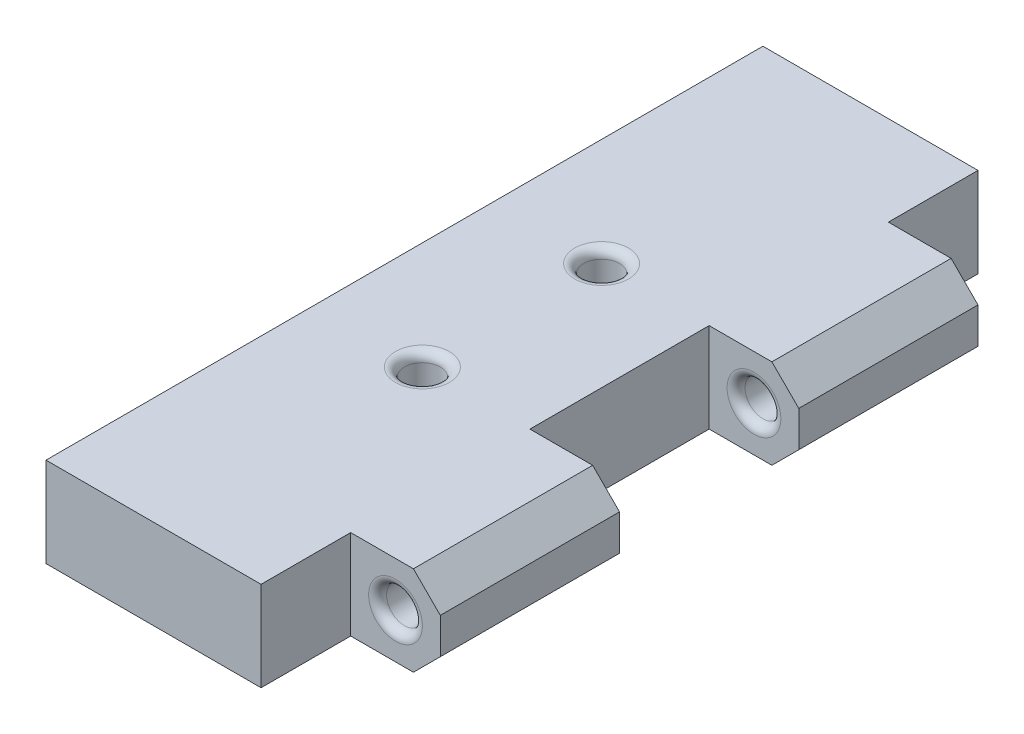
ISO-10303-21;
HEADER;
FILE_DESCRIPTION(('STEP AP214'),'2;1');
FILE_NAME('part.step','',(''),(''),'','','');
FILE_SCHEMA(('AUTOMOTIVE_DESIGN { 1 0 10303 214 1 1 1 1 }'));
ENDSEC;
DATA;
#1=APPLICATION_CONTEXT('core data for automotive mechanical design processes');
#2=APPLICATION_PROTOCOL_DEFINITION('international standard','automotive_design',2000,#1);
#3=PRODUCT_CONTEXT('',#1,'mechanical');
#4=PRODUCT('Part','Part','',(#3));
#5=PRODUCT_RELATED_PRODUCT_CATEGORY('part','',(#4));
#6=PRODUCT_DEFINITION_FORMATION('','',#4);
#7=PRODUCT_DEFINITION_CONTEXT('part definition',#1,'design');
#8=PRODUCT_DEFINITION('design','',#6,#7);
#9=PRODUCT_DEFINITION_SHAPE('','',#8);
#10=(LENGTH_UNIT() NAMED_UNIT(*) SI_UNIT(.MILLI.,.METRE.));
#11=(NAMED_UNIT(*) PLANE_ANGLE_UNIT() SI_UNIT($,.RADIAN.));
#12=(NAMED_UNIT(*) SI_UNIT($,.STERADIAN.) SOLID_ANGLE_UNIT());
#13=UNCERTAINTY_MEASURE_WITH_UNIT(LENGTH_MEASURE(1.E-05),#10,'distance_accuracy_value','');
#14=(GEOMETRIC_REPRESENTATION_CONTEXT(3) GLOBAL_UNCERTAINTY_ASSIGNED_CONTEXT((#13)) GLOBAL_UNIT_ASSIGNED_CONTEXT((#10,
#11,#12)) REPRESENTATION_CONTEXT('',''));
#15=CARTESIAN_POINT('',(0.,0.,0.));
#16=DIRECTION('',(0.,0.,1.));
#17=DIRECTION('',(1.,0.,0.));
#18=AXIS2_PLACEMENT_3D('',#15,#16,#17);
#19=CARTESIAN_POINT('',(6.,5.,20.));
#20=DIRECTION('',(-1.,0.,0.));
#21=DIRECTION('',(0.,0.,1.));
#22=AXIS2_PLACEMENT_3D('',#19,#20,#21);
#23=PLANE('',#22);
#24=DIRECTION('',(0.,-1.,0.));
#25=VECTOR('',#24,1.);
#26=CARTESIAN_POINT('',(6.,0.,-5.));
#27=LINE('',#26,#25);
#28=CARTESIAN_POINT('',(6.,5.,-5.));
#29=VERTEX_POINT('',#28);
#30=CARTESIAN_POINT('',(6.,0.,-5.));
#31=VERTEX_POINT('',#30);
#32=EDGE_CURVE('E180',#29,#31,#27,.T.);
#33=ORIENTED_EDGE('',*,*,#32,.F.);
#34=DIRECTION('',(0.,0.,-1.));
#35=VECTOR('',#34,1.);
#36=CARTESIAN_POINT('',(6.,5.,20.));
#37=LINE('',#36,#35);
#38=CARTESIAN_POINT('',(6.,5.,5.));
#39=VERTEX_POINT('',#38);
#40=EDGE_CURVE('E222',#39,#29,#37,.T.);
#41=ORIENTED_EDGE('',*,*,#40,.F.);
#42=DIRECTION('',(0.,1.,0.));
#43=VECTOR('',#42,1.);
#44=CARTESIAN_POINT('',(6.,0.,5.));
#45=LINE('',#44,#43);
#46=CARTESIAN_POINT('',(6.,0.,5.));
#47=VERTEX_POINT('',#46);
#48=EDGE_CURVE('E198',#47,#39,#45,.T.);
#49=ORIENTED_EDGE('',*,*,#48,.F.);
#50=DIRECTION('',(0.,0.,-1.));
#51=VECTOR('',#50,1.);
#52=CARTESIAN_POINT('',(6.,0.,20.));
#53=LINE('',#52,#51);
#54=EDGE_CURVE('E172',#47,#31,#53,.T.);
#55=ORIENTED_EDGE('',*,*,#54,.T.);
#56=EDGE_LOOP('',(#33,#41,#49,#55));
#57=FACE_BOUND('',#56,.T.);
#58=ADVANCED_FACE('F36',(#57),#23,.F.);
#59=DIRECTION('',(0.,1.,0.));
#60=VECTOR('',#59,1.);
#61=CARTESIAN_POINT('',(6.,0.,-15.));
#62=LINE('',#61,#60);
#63=CARTESIAN_POINT('',(6.,0.,-15.));
#64=VERTEX_POINT('',#63);
#65=CARTESIAN_POINT('',(6.,5.,-15.));
#66=VERTEX_POINT('',#65);
#67=EDGE_CURVE('E156',#64,#66,#62,.T.);
#68=ORIENTED_EDGE('',*,*,#67,.F.);
#69=CARTESIAN_POINT('',(6.,0.,-20.));
#70=VERTEX_POINT('',#69);
#71=EDGE_CURVE('E165',#64,#70,#53,.T.);
#72=ORIENTED_EDGE('',*,*,#71,.T.);
#73=DIRECTION('',(0.,-1.,0.));
#74=VECTOR('',#73,1.);
#75=CARTESIAN_POINT('',(6.,5.,-20.));
#76=LINE('',#75,#74);
#77=CARTESIAN_POINT('',(6.,5.,-20.));
#78=VERTEX_POINT('',#77);
#79=EDGE_CURVE('E232',#78,#70,#76,.T.);
#80=ORIENTED_EDGE('',*,*,#79,.F.);
#81=EDGE_CURVE('E178',#66,#78,#37,.T.);
#82=ORIENTED_EDGE('',*,*,#81,.F.);
#83=EDGE_LOOP('',(#68,#72,#80,#82));
#84=FACE_BOUND('',#83,.T.);
#85=ADVANCED_FACE('F177',(#84),#23,.F.);
#86=DIRECTION('',(0.,-1.,0.));
#87=VECTOR('',#86,1.);
#88=CARTESIAN_POINT('',(6.,0.,15.));
#89=LINE('',#88,#87);
#90=CARTESIAN_POINT('',(6.,5.,15.));
#91=VERTEX_POINT('',#90);
#92=CARTESIAN_POINT('',(6.,0.,15.));
#93=VERTEX_POINT('',#92);
#94=EDGE_CURVE('E193',#91,#93,#89,.T.);
#95=ORIENTED_EDGE('',*,*,#94,.F.);
#96=CARTESIAN_POINT('',(6.,5.,20.));
#97=VERTEX_POINT('',#96);
#98=EDGE_CURVE('E218',#97,#91,#37,.T.);
#99=ORIENTED_EDGE('',*,*,#98,.F.);
#100=DIRECTION('',(0.,-1.,0.));
#101=VECTOR('',#100,1.);
#102=CARTESIAN_POINT('',(6.,5.,20.));
#103=LINE('',#102,#101);
#104=CARTESIAN_POINT('',(6.,0.,20.));
#105=VERTEX_POINT('',#104);
#106=EDGE_CURVE('E234',#97,#105,#103,.T.);
#107=ORIENTED_EDGE('',*,*,#106,.T.);
#108=EDGE_CURVE('E175',#105,#93,#53,.T.);
#109=ORIENTED_EDGE('',*,*,#108,.T.);
#110=EDGE_LOOP('',(#95,#99,#107,#109));
#111=FACE_BOUND('',#110,.T.);
#112=ADVANCED_FACE('F339',(#111),#23,.F.);
#113=CARTESIAN_POINT('',(0.,5.,0.));
#114=DIRECTION('',(0.,1.,0.));
#115=DIRECTION('',(0.,0.,1.));
#116=AXIS2_PLACEMENT_3D('',#113,#114,#115);
#117=PLANE('',#116);
#118=CARTESIAN_POINT('',(0.,5.,5.));
#119=DIRECTION('',(0.,1.,0.));
#120=DIRECTION('',(0.,0.,1.));
#121=AXIS2_PLACEMENT_3D('',#118,#119,#120);
#122=CIRCLE('',#121,1.5);
#123=CARTESIAN_POINT('',(0.,5.,6.5));
#124=VERTEX_POINT('',#123);
#125=EDGE_CURVE('E255',#124,#124,#122,.F.);
#126=ORIENTED_EDGE('',*,*,#125,.T.);
#127=EDGE_LOOP('',(#126));
#128=FACE_BOUND('',#127,.T.);
#129=CARTESIAN_POINT('',(0.,5.,-5.));
#130=DIRECTION('',(0.,1.,0.));
#131=DIRECTION('',(0.,0.,1.));
#132=AXIS2_PLACEMENT_3D('',#129,#130,#131);
#133=CIRCLE('',#132,1.5);
#134=CARTESIAN_POINT('',(0.,5.,-3.5));
#135=VERTEX_POINT('',#134);
#136=EDGE_CURVE('E252',#135,#135,#133,.F.);
#137=ORIENTED_EDGE('',*,*,#136,.T.);
#138=EDGE_LOOP('',(#137));
#139=FACE_BOUND('',#138,.T.);
#140=DIRECTION('',(-1.,0.,0.));
#141=VECTOR('',#140,1.);
#142=CARTESIAN_POINT('',(11.,5.,-5.));
#143=LINE('',#142,#141);
#144=CARTESIAN_POINT('',(9.5,5.,-5.));
#145=VERTEX_POINT('',#144);
#146=EDGE_CURVE('E189',#145,#29,#143,.T.);
#147=ORIENTED_EDGE('',*,*,#146,.F.);
#148=DIRECTION('',(0.,0.,-1.));
#149=VECTOR('',#148,1.);
#150=CARTESIAN_POINT('',(9.5,5.,0.));
#151=LINE('',#150,#149);
#152=CARTESIAN_POINT('',(9.5,5.,-15.));
#153=VERTEX_POINT('',#152);
#154=EDGE_CURVE('E300',#145,#153,#151,.T.);
#155=ORIENTED_EDGE('',*,*,#154,.T.);
#156=DIRECTION('',(-1.,0.,0.));
#157=VECTOR('',#156,1.);
#158=CARTESIAN_POINT('',(11.,5.,-15.));
#159=LINE('',#158,#157);
#160=EDGE_CURVE('E162',#153,#66,#159,.T.);
#161=ORIENTED_EDGE('',*,*,#160,.T.);
#162=ORIENTED_EDGE('',*,*,#81,.T.);
#163=DIRECTION('',(-1.,0.,0.));
#164=VECTOR('',#163,1.);
#165=CARTESIAN_POINT('',(6.,5.,-20.));
#166=LINE('',#165,#164);
#167=CARTESIAN_POINT('',(-6.,5.,-20.));
#168=VERTEX_POINT('',#167);
#169=EDGE_CURVE('E221',#78,#168,#166,.T.);
#170=ORIENTED_EDGE('',*,*,#169,.T.);
#171=DIRECTION('',(0.,0.,1.));
#172=VECTOR('',#171,1.);
#173=CARTESIAN_POINT('',(-6.,5.,20.));
#174=LINE('',#173,#172);
#175=CARTESIAN_POINT('',(-6.,5.,20.));
#176=VERTEX_POINT('',#175);
#177=EDGE_CURVE('E213',#168,#176,#174,.T.);
#178=ORIENTED_EDGE('',*,*,#177,.T.);
#179=DIRECTION('',(1.,0.,0.));
#180=VECTOR('',#179,1.);
#181=CARTESIAN_POINT('',(6.,5.,20.));
#182=LINE('',#181,#180);
#183=EDGE_CURVE('E216',#176,#97,#182,.T.);
#184=ORIENTED_EDGE('',*,*,#183,.T.);
#185=ORIENTED_EDGE('',*,*,#98,.T.);
#186=DIRECTION('',(-1.,0.,0.));
#187=VECTOR('',#186,1.);
#188=CARTESIAN_POINT('',(11.,5.,15.));
#189=LINE('',#188,#187);
#190=CARTESIAN_POINT('',(9.5,5.,15.));
#191=VERTEX_POINT('',#190);
#192=EDGE_CURVE('E200',#191,#91,#189,.T.);
#193=ORIENTED_EDGE('',*,*,#192,.F.);
#194=DIRECTION('',(0.,0.,-1.));
#195=VECTOR('',#194,1.);
#196=CARTESIAN_POINT('',(9.5,5.,0.));
#197=LINE('',#196,#195);
#198=CARTESIAN_POINT('',(9.5,5.,5.));
#199=VERTEX_POINT('',#198);
#200=EDGE_CURVE('E298',#191,#199,#197,.T.);
#201=ORIENTED_EDGE('',*,*,#200,.T.);
#202=DIRECTION('',(-1.,0.,0.));
#203=VECTOR('',#202,1.);
#204=CARTESIAN_POINT('',(11.,5.,5.));
#205=LINE('',#204,#203);
#206=EDGE_CURVE('E206',#199,#39,#205,.T.);
#207=ORIENTED_EDGE('',*,*,#206,.T.);
#208=ORIENTED_EDGE('',*,*,#40,.T.);
#209=EDGE_LOOP('',(#147,#155,#161,#162,#170,#178,#184,#185,#193,#201,#207,#208));
#210=FACE_BOUND('',#209,.T.);
#211=ADVANCED_FACE('F326',(#128,#139,#210),#117,.T.);
#212=CARTESIAN_POINT('',(0.,0.,0.));
#213=DIRECTION('',(0.,1.,0.));
#214=DIRECTION('',(0.,0.,1.));
#215=AXIS2_PLACEMENT_3D('',#212,#213,#214);
#216=PLANE('',#215);
#217=CARTESIAN_POINT('',(0.,0.,5.));
#218=DIRECTION('',(0.,1.,0.));
#219=DIRECTION('',(0.,0.,1.));
#220=AXIS2_PLACEMENT_3D('',#217,#218,#219);
#221=CIRCLE('',#220,1.5);
#222=CARTESIAN_POINT('',(0.,0.,6.5));
#223=VERTEX_POINT('',#222);
#224=EDGE_CURVE('E243',#223,#223,#221,.T.);
#225=ORIENTED_EDGE('',*,*,#224,.T.);
#226=EDGE_LOOP('',(#225));
#227=FACE_BOUND('',#226,.T.);
#228=CARTESIAN_POINT('',(0.,0.,-5.));
#229=DIRECTION('',(0.,1.,0.));
#230=DIRECTION('',(0.,0.,1.));
#231=AXIS2_PLACEMENT_3D('',#228,#229,#230);
#232=CIRCLE('',#231,1.5);
#233=CARTESIAN_POINT('',(0.,0.,-3.5));
#234=VERTEX_POINT('',#233);
#235=EDGE_CURVE('E240',#234,#234,#232,.T.);
#236=ORIENTED_EDGE('',*,*,#235,.T.);
#237=EDGE_LOOP('',(#236));
#238=FACE_BOUND('',#237,.T.);
#239=DIRECTION('',(-1.,0.,0.));
#240=VECTOR('',#239,1.);
#241=CARTESIAN_POINT('',(11.,0.,-15.));
#242=LINE('',#241,#240);
#243=CARTESIAN_POINT('',(9.5,0.,-15.));
#244=VERTEX_POINT('',#243);
#245=EDGE_CURVE('E151',#244,#64,#242,.T.);
#246=ORIENTED_EDGE('',*,*,#245,.F.);
#247=DIRECTION('',(0.,0.,1.));
#248=VECTOR('',#247,1.);
#249=CARTESIAN_POINT('',(9.5,0.,-5.));
#250=LINE('',#249,#248);
#251=CARTESIAN_POINT('',(9.5,0.,-5.));
#252=VERTEX_POINT('',#251);
#253=EDGE_CURVE('E307',#244,#252,#250,.T.);
#254=ORIENTED_EDGE('',*,*,#253,.T.);
#255=DIRECTION('',(-1.,0.,0.));
#256=VECTOR('',#255,1.);
#257=CARTESIAN_POINT('',(11.,0.,-5.));
#258=LINE('',#257,#256);
#259=EDGE_CURVE('E161',#252,#31,#258,.T.);
#260=ORIENTED_EDGE('',*,*,#259,.T.);
#261=ORIENTED_EDGE('',*,*,#54,.F.);
#262=DIRECTION('',(-1.,0.,0.));
#263=VECTOR('',#262,1.);
#264=CARTESIAN_POINT('',(11.,0.,5.));
#265=LINE('',#264,#263);
#266=CARTESIAN_POINT('',(9.5,0.,5.));
#267=VERTEX_POINT('',#266);
#268=EDGE_CURVE('E208',#267,#47,#265,.T.);
#269=ORIENTED_EDGE('',*,*,#268,.F.);
#270=DIRECTION('',(0.,0.,1.));
#271=VECTOR('',#270,1.);
#272=CARTESIAN_POINT('',(9.5,0.,15.));
#273=LINE('',#272,#271);
#274=CARTESIAN_POINT('',(9.5,0.,15.));
#275=VERTEX_POINT('',#274);
#276=EDGE_CURVE('E305',#267,#275,#273,.T.);
#277=ORIENTED_EDGE('',*,*,#276,.T.);
#278=DIRECTION('',(-1.,0.,0.));
#279=VECTOR('',#278,1.);
#280=CARTESIAN_POINT('',(11.,0.,15.));
#281=LINE('',#280,#279);
#282=EDGE_CURVE('E210',#275,#93,#281,.T.);
#283=ORIENTED_EDGE('',*,*,#282,.T.);
#284=ORIENTED_EDGE('',*,*,#108,.F.);
#285=DIRECTION('',(1.,0.,0.));
#286=VECTOR('',#285,1.);
#287=CARTESIAN_POINT('',(6.,0.,20.));
#288=LINE('',#287,#286);
#289=CARTESIAN_POINT('',(-6.,0.,20.));
#290=VERTEX_POINT('',#289);
#291=EDGE_CURVE('E173',#290,#105,#288,.T.);
#292=ORIENTED_EDGE('',*,*,#291,.F.);
#293=DIRECTION('',(0.,0.,1.));
#294=VECTOR('',#293,1.);
#295=CARTESIAN_POINT('',(-6.,0.,20.));
#296=LINE('',#295,#294);
#297=CARTESIAN_POINT('',(-6.,0.,-20.));
#298=VERTEX_POINT('',#297);
#299=EDGE_CURVE('E212',#298,#290,#296,.T.);
#300=ORIENTED_EDGE('',*,*,#299,.F.);
#301=DIRECTION('',(-1.,0.,0.));
#302=VECTOR('',#301,1.);
#303=CARTESIAN_POINT('',(6.,0.,-20.));
#304=LINE('',#303,#302);
#305=EDGE_CURVE('E168',#70,#298,#304,.T.);
#306=ORIENTED_EDGE('',*,*,#305,.F.);
#307=ORIENTED_EDGE('',*,*,#71,.F.);
#308=EDGE_LOOP('',(#246,#254,#260,#261,#269,#277,#283,#284,#292,#300,#306,#307));
#309=FACE_BOUND('',#308,.T.);
#310=ADVANCED_FACE('F166',(#227,#238,#309),#216,.F.);
#311=CARTESIAN_POINT('',(-6.,5.,20.));
#312=DIRECTION('',(1.,0.,0.));
#313=DIRECTION('',(0.,0.,-1.));
#314=AXIS2_PLACEMENT_3D('',#311,#312,#313);
#315=PLANE('',#314);
#316=ORIENTED_EDGE('',*,*,#299,.T.);
#317=DIRECTION('',(0.,-1.,0.));
#318=VECTOR('',#317,1.);
#319=CARTESIAN_POINT('',(-6.,5.,20.));
#320=LINE('',#319,#318);
#321=EDGE_CURVE('E237',#176,#290,#320,.T.);
#322=ORIENTED_EDGE('',*,*,#321,.F.);
#323=ORIENTED_EDGE('',*,*,#177,.F.);
#324=DIRECTION('',(0.,-1.,0.));
#325=VECTOR('',#324,1.);
#326=CARTESIAN_POINT('',(-6.,5.,-20.));
#327=LINE('',#326,#325);
#328=EDGE_CURVE('E224',#168,#298,#327,.T.);
#329=ORIENTED_EDGE('',*,*,#328,.T.);
#330=EDGE_LOOP('',(#316,#322,#323,#329));
#331=FACE_BOUND('',#330,.T.);
#332=ADVANCED_FACE('F345',(#331),#315,.F.);
#333=CARTESIAN_POINT('',(6.,5.,20.));
#334=DIRECTION('',(0.,0.,-1.));
#335=DIRECTION('',(-1.,0.,0.));
#336=AXIS2_PLACEMENT_3D('',#333,#334,#335);
#337=PLANE('',#336);
#338=ORIENTED_EDGE('',*,*,#291,.T.);
#339=ORIENTED_EDGE('',*,*,#106,.F.);
#340=ORIENTED_EDGE('',*,*,#183,.F.);
#341=ORIENTED_EDGE('',*,*,#321,.T.);
#342=EDGE_LOOP('',(#338,#339,#340,#341));
#343=FACE_BOUND('',#342,.T.);
#344=ADVANCED_FACE('F342',(#343),#337,.F.);
#345=CARTESIAN_POINT('',(6.,5.,-20.));
#346=DIRECTION('',(0.,0.,1.));
#347=DIRECTION('',(1.,0.,0.));
#348=AXIS2_PLACEMENT_3D('',#345,#346,#347);
#349=PLANE('',#348);
#350=ORIENTED_EDGE('',*,*,#305,.T.);
#351=ORIENTED_EDGE('',*,*,#328,.F.);
#352=ORIENTED_EDGE('',*,*,#169,.F.);
#353=ORIENTED_EDGE('',*,*,#79,.T.);
#354=EDGE_LOOP('',(#350,#351,#352,#353));
#355=FACE_BOUND('',#354,.T.);
#356=ADVANCED_FACE('F350',(#355),#349,.F.);
#357=CARTESIAN_POINT('',(0.,5.,-5.));
#358=DIRECTION('',(0.,-1.,0.));
#359=DIRECTION('',(0.,0.,-1.));
#360=AXIS2_PLACEMENT_3D('',#357,#358,#359);
#361=CYLINDRICAL_SURFACE('',#360,1.);
#362=CARTESIAN_POINT('',(0.,0.5,-5.));
#363=DIRECTION('',(0.,1.,0.));
#364=DIRECTION('',(0.,0.,1.));
#365=AXIS2_PLACEMENT_3D('',#362,#363,#364);
#366=CIRCLE('',#365,1.);
#367=CARTESIAN_POINT('',(0.,0.5,-4.));
#368=VERTEX_POINT('',#367);
#369=EDGE_CURVE('E261',#368,#368,#366,.F.);
#370=ORIENTED_EDGE('',*,*,#369,.T.);
#371=EDGE_LOOP('',(#370));
#372=FACE_BOUND('',#371,.T.);
#373=CARTESIAN_POINT('',(0.,4.5,-5.));
#374=DIRECTION('',(0.,1.,0.));
#375=DIRECTION('',(0.,0.,1.));
#376=AXIS2_PLACEMENT_3D('',#373,#374,#375);
#377=CIRCLE('',#376,1.);
#378=CARTESIAN_POINT('',(0.,4.5,-4.));
#379=VERTEX_POINT('',#378);
#380=EDGE_CURVE('E258',#379,#379,#377,.T.);
#381=ORIENTED_EDGE('',*,*,#380,.T.);
#382=EDGE_LOOP('',(#381));
#383=FACE_BOUND('',#382,.T.);
#384=ADVANCED_FACE('F399',(#372,#383),#361,.F.);
#385=CARTESIAN_POINT('',(0.,5.,5.));
#386=DIRECTION('',(0.,-1.,0.));
#387=DIRECTION('',(0.,0.,-1.));
#388=AXIS2_PLACEMENT_3D('',#385,#386,#387);
#389=CYLINDRICAL_SURFACE('',#388,1.);
#390=CARTESIAN_POINT('',(0.,0.5,5.));
#391=DIRECTION('',(0.,1.,0.));
#392=DIRECTION('',(0.,0.,1.));
#393=AXIS2_PLACEMENT_3D('',#390,#391,#392);
#394=CIRCLE('',#393,1.);
#395=CARTESIAN_POINT('',(0.,0.5,6.));
#396=VERTEX_POINT('',#395);
#397=EDGE_CURVE('E249',#396,#396,#394,.F.);
#398=ORIENTED_EDGE('',*,*,#397,.T.);
#399=EDGE_LOOP('',(#398));
#400=FACE_BOUND('',#399,.T.);
#401=CARTESIAN_POINT('',(0.,4.5,5.));
#402=DIRECTION('',(0.,1.,0.));
#403=DIRECTION('',(0.,0.,1.));
#404=AXIS2_PLACEMENT_3D('',#401,#402,#403);
#405=CIRCLE('',#404,1.);
#406=CARTESIAN_POINT('',(0.,4.5,6.));
#407=VERTEX_POINT('',#406);
#408=EDGE_CURVE('E246',#407,#407,#405,.T.);
#409=ORIENTED_EDGE('',*,*,#408,.T.);
#410=EDGE_LOOP('',(#409));
#411=FACE_BOUND('',#410,.T.);
#412=ADVANCED_FACE('F406',(#400,#411),#389,.F.);
#413=CARTESIAN_POINT('',(11.,0.,15.));
#414=DIRECTION('',(0.,0.,-1.));
#415=DIRECTION('',(-1.,0.,0.));
#416=AXIS2_PLACEMENT_3D('',#413,#414,#415);
#417=PLANE('',#416);
#418=CARTESIAN_POINT('',(8.5,2.5,15.));
#419=DIRECTION('',(0.,0.,-1.));
#420=DIRECTION('',(-1.,0.,0.));
#421=AXIS2_PLACEMENT_3D('',#418,#419,#420);
#422=CIRCLE('',#421,1.5);
#423=CARTESIAN_POINT('',(7.,2.5,15.));
#424=VERTEX_POINT('',#423);
#425=EDGE_CURVE('E273',#424,#424,#422,.T.);
#426=ORIENTED_EDGE('',*,*,#425,.T.);
#427=EDGE_LOOP('',(#426));
#428=FACE_BOUND('',#427,.T.);
#429=ORIENTED_EDGE('',*,*,#282,.F.);
#430=DIRECTION('',(0.707106781186548,0.707106781186547,0.));
#431=VECTOR('',#430,1.);
#432=CARTESIAN_POINT('',(11.,1.5,15.));
#433=LINE('',#432,#431);
#434=CARTESIAN_POINT('',(11.,1.5,15.));
#435=VERTEX_POINT('',#434);
#436=EDGE_CURVE('E11',#275,#435,#433,.T.);
#437=ORIENTED_EDGE('',*,*,#436,.T.);
#438=DIRECTION('',(0.,-1.,0.));
#439=VECTOR('',#438,1.);
#440=CARTESIAN_POINT('',(11.,0.,15.));
#441=LINE('',#440,#439);
#442=CARTESIAN_POINT('',(11.,3.5,15.));
#443=VERTEX_POINT('',#442);
#444=EDGE_CURVE('E194',#443,#435,#441,.T.);
#445=ORIENTED_EDGE('',*,*,#444,.F.);
#446=DIRECTION('',(0.707106781186548,-0.707106781186547,0.));
#447=VECTOR('',#446,1.);
#448=CARTESIAN_POINT('',(11.,3.5,15.));
#449=LINE('',#448,#447);
#450=EDGE_CURVE('E44',#443,#191,#449,.F.);
#451=ORIENTED_EDGE('',*,*,#450,.T.);
#452=ORIENTED_EDGE('',*,*,#192,.T.);
#453=ORIENTED_EDGE('',*,*,#94,.T.);
#454=EDGE_LOOP('',(#429,#437,#445,#451,#452,#453));
#455=FACE_BOUND('',#454,.T.);
#456=ADVANCED_FACE('F319',(#428,#455),#417,.F.);
#457=CARTESIAN_POINT('',(11.,0.,5.));
#458=DIRECTION('',(0.,0.,1.));
#459=DIRECTION('',(1.,0.,0.));
#460=AXIS2_PLACEMENT_3D('',#457,#458,#459);
#461=PLANE('',#460);
#462=CARTESIAN_POINT('',(8.5,2.5,5.));
#463=DIRECTION('',(0.,0.,1.));
#464=DIRECTION('',(1.,0.,0.));
#465=AXIS2_PLACEMENT_3D('',#462,#463,#464);
#466=CIRCLE('',#465,1.5);
#467=CARTESIAN_POINT('',(10.,2.5,5.));
#468=VERTEX_POINT('',#467);
#469=EDGE_CURVE('E264',#468,#468,#466,.T.);
#470=ORIENTED_EDGE('',*,*,#469,.T.);
#471=EDGE_LOOP('',(#470));
#472=FACE_BOUND('',#471,.T.);
#473=DIRECTION('',(0.,1.,0.));
#474=VECTOR('',#473,1.);
#475=CARTESIAN_POINT('',(11.,0.,5.));
#476=LINE('',#475,#474);
#477=CARTESIAN_POINT('',(11.,1.5,5.));
#478=VERTEX_POINT('',#477);
#479=CARTESIAN_POINT('',(11.,3.5,5.));
#480=VERTEX_POINT('',#479);
#481=EDGE_CURVE('E197',#478,#480,#476,.T.);
#482=ORIENTED_EDGE('',*,*,#481,.F.);
#483=DIRECTION('',(-0.707106781186548,-0.707106781186547,0.));
#484=VECTOR('',#483,1.);
#485=CARTESIAN_POINT('',(11.,1.5,5.));
#486=LINE('',#485,#484);
#487=EDGE_CURVE('E59',#478,#267,#486,.T.);
#488=ORIENTED_EDGE('',*,*,#487,.T.);
#489=ORIENTED_EDGE('',*,*,#268,.T.);
#490=ORIENTED_EDGE('',*,*,#48,.T.);
#491=ORIENTED_EDGE('',*,*,#206,.F.);
#492=DIRECTION('',(-0.707106781186548,0.707106781186547,0.));
#493=VECTOR('',#492,1.);
#494=CARTESIAN_POINT('',(11.,3.5,5.));
#495=LINE('',#494,#493);
#496=EDGE_CURVE('E51',#199,#480,#495,.F.);
#497=ORIENTED_EDGE('',*,*,#496,.T.);
#498=EDGE_LOOP('',(#482,#488,#489,#490,#491,#497));
#499=FACE_BOUND('',#498,.T.);
#500=ADVANCED_FACE('F330',(#472,#499),#461,.F.);
#501=CARTESIAN_POINT('',(11.,0.,0.));
#502=DIRECTION('',(1.,0.,0.));
#503=DIRECTION('',(0.,0.,-1.));
#504=AXIS2_PLACEMENT_3D('',#501,#502,#503);
#505=PLANE('',#504);
#506=ORIENTED_EDGE('',*,*,#444,.T.);
#507=DIRECTION('',(0.,0.,-1.));
#508=VECTOR('',#507,1.);
#509=CARTESIAN_POINT('',(11.,1.5,5.));
#510=LINE('',#509,#508);
#511=EDGE_CURVE('E312',#435,#478,#510,.T.);
#512=ORIENTED_EDGE('',*,*,#511,.T.);
#513=ORIENTED_EDGE('',*,*,#481,.T.);
#514=DIRECTION('',(0.,0.,1.));
#515=VECTOR('',#514,1.);
#516=CARTESIAN_POINT('',(11.,3.5,0.));
#517=LINE('',#516,#515);
#518=EDGE_CURVE('E309',#480,#443,#517,.T.);
#519=ORIENTED_EDGE('',*,*,#518,.T.);
#520=EDGE_LOOP('',(#506,#512,#513,#519));
#521=FACE_BOUND('',#520,.T.);
#522=ADVANCED_FACE('F329',(#521),#505,.T.);
#523=CARTESIAN_POINT('',(11.,0.,-5.));
#524=DIRECTION('',(0.,0.,-1.));
#525=DIRECTION('',(-1.,0.,0.));
#526=AXIS2_PLACEMENT_3D('',#523,#524,#525);
#527=PLANE('',#526);
#528=CARTESIAN_POINT('',(8.5,2.5,-5.));
#529=DIRECTION('',(0.,0.,-1.));
#530=DIRECTION('',(-1.,0.,0.));
#531=AXIS2_PLACEMENT_3D('',#528,#529,#530);
#532=CIRCLE('',#531,1.5);
#533=CARTESIAN_POINT('',(7.,2.5,-5.));
#534=VERTEX_POINT('',#533);
#535=EDGE_CURVE('E285',#534,#534,#532,.T.);
#536=ORIENTED_EDGE('',*,*,#535,.T.);
#537=EDGE_LOOP('',(#536));
#538=FACE_BOUND('',#537,.T.);
#539=DIRECTION('',(0.,-1.,0.));
#540=VECTOR('',#539,1.);
#541=CARTESIAN_POINT('',(11.,0.,-5.));
#542=LINE('',#541,#540);
#543=CARTESIAN_POINT('',(11.,3.5,-5.));
#544=VERTEX_POINT('',#543);
#545=CARTESIAN_POINT('',(11.,1.5,-5.));
#546=VERTEX_POINT('',#545);
#547=EDGE_CURVE('E179',#544,#546,#542,.T.);
#548=ORIENTED_EDGE('',*,*,#547,.F.);
#549=DIRECTION('',(0.707106781186548,-0.707106781186547,0.));
#550=VECTOR('',#549,1.);
#551=CARTESIAN_POINT('',(11.,3.5,-5.));
#552=LINE('',#551,#550);
#553=EDGE_CURVE('E296',#544,#145,#552,.F.);
#554=ORIENTED_EDGE('',*,*,#553,.T.);
#555=ORIENTED_EDGE('',*,*,#146,.T.);
#556=ORIENTED_EDGE('',*,*,#32,.T.);
#557=ORIENTED_EDGE('',*,*,#259,.F.);
#558=DIRECTION('',(0.707106781186548,0.707106781186547,0.));
#559=VECTOR('',#558,1.);
#560=CARTESIAN_POINT('',(11.,1.5,-5.));
#561=LINE('',#560,#559);
#562=EDGE_CURVE('E294',#252,#546,#561,.T.);
#563=ORIENTED_EDGE('',*,*,#562,.T.);
#564=EDGE_LOOP('',(#548,#554,#555,#556,#557,#563));
#565=FACE_BOUND('',#564,.T.);
#566=ADVANCED_FACE('F359',(#538,#565),#527,.F.);
#567=CARTESIAN_POINT('',(11.,0.,-15.));
#568=DIRECTION('',(0.,0.,1.));
#569=DIRECTION('',(1.,0.,0.));
#570=AXIS2_PLACEMENT_3D('',#567,#568,#569);
#571=PLANE('',#570);
#572=CARTESIAN_POINT('',(8.5,2.5,-15.));
#573=DIRECTION('',(0.,0.,1.));
#574=DIRECTION('',(1.,0.,0.));
#575=AXIS2_PLACEMENT_3D('',#572,#573,#574);
#576=CIRCLE('',#575,1.5);
#577=CARTESIAN_POINT('',(10.,2.5,-15.));
#578=VERTEX_POINT('',#577);
#579=EDGE_CURVE('E276',#578,#578,#576,.T.);
#580=ORIENTED_EDGE('',*,*,#579,.T.);
#581=EDGE_LOOP('',(#580));
#582=FACE_BOUND('',#581,.T.);
#583=ORIENTED_EDGE('',*,*,#160,.F.);
#584=DIRECTION('',(-0.707106781186548,0.707106781186547,0.));
#585=VECTOR('',#584,1.);
#586=CARTESIAN_POINT('',(11.,3.5,-15.));
#587=LINE('',#586,#585);
#588=CARTESIAN_POINT('',(11.,3.5,-15.));
#589=VERTEX_POINT('',#588);
#590=EDGE_CURVE('E303',#153,#589,#587,.F.);
#591=ORIENTED_EDGE('',*,*,#590,.T.);
#592=DIRECTION('',(0.,1.,0.));
#593=VECTOR('',#592,1.);
#594=CARTESIAN_POINT('',(11.,0.,-15.));
#595=LINE('',#594,#593);
#596=CARTESIAN_POINT('',(11.,1.5,-15.));
#597=VERTEX_POINT('',#596);
#598=EDGE_CURVE('E183',#597,#589,#595,.T.);
#599=ORIENTED_EDGE('',*,*,#598,.F.);
#600=DIRECTION('',(-0.707106781186548,-0.707106781186547,0.));
#601=VECTOR('',#600,1.);
#602=CARTESIAN_POINT('',(11.,1.5,-15.));
#603=LINE('',#602,#601);
#604=EDGE_CURVE('E158',#597,#244,#603,.T.);
#605=ORIENTED_EDGE('',*,*,#604,.T.);
#606=ORIENTED_EDGE('',*,*,#245,.T.);
#607=ORIENTED_EDGE('',*,*,#67,.T.);
#608=EDGE_LOOP('',(#583,#591,#599,#605,#606,#607));
#609=FACE_BOUND('',#608,.T.);
#610=ADVANCED_FACE('F154',(#582,#609),#571,.F.);
#611=CARTESIAN_POINT('',(11.,0.,0.));
#612=DIRECTION('',(1.,0.,0.));
#613=DIRECTION('',(0.,0.,-1.));
#614=AXIS2_PLACEMENT_3D('',#611,#612,#613);
#615=PLANE('',#614);
#616=ORIENTED_EDGE('',*,*,#598,.T.);
#617=DIRECTION('',(0.,0.,1.));
#618=VECTOR('',#617,1.);
#619=CARTESIAN_POINT('',(11.,3.5,0.));
#620=LINE('',#619,#618);
#621=EDGE_CURVE('E291',#589,#544,#620,.T.);
#622=ORIENTED_EDGE('',*,*,#621,.T.);
#623=ORIENTED_EDGE('',*,*,#547,.T.);
#624=DIRECTION('',(0.,0.,-1.));
#625=VECTOR('',#624,1.);
#626=CARTESIAN_POINT('',(11.,1.5,-15.));
#627=LINE('',#626,#625);
#628=EDGE_CURVE('E288',#546,#597,#627,.T.);
#629=ORIENTED_EDGE('',*,*,#628,.T.);
#630=EDGE_LOOP('',(#616,#622,#623,#629));
#631=FACE_BOUND('',#630,.T.);
#632=ADVANCED_FACE('F367',(#631),#615,.T.);
#633=CARTESIAN_POINT('',(8.5,2.5,20.));
#634=DIRECTION('',(0.,0.,-1.));
#635=DIRECTION('',(-1.,0.,0.));
#636=AXIS2_PLACEMENT_3D('',#633,#634,#635);
#637=CYLINDRICAL_SURFACE('',#636,1.);
#638=CARTESIAN_POINT('',(8.5,2.5,-14.5));
#639=DIRECTION('',(0.,0.,1.));
#640=DIRECTION('',(1.,0.,0.));
#641=AXIS2_PLACEMENT_3D('',#638,#639,#640);
#642=CIRCLE('',#641,1.);
#643=CARTESIAN_POINT('',(9.5,2.5,-14.5));
#644=VERTEX_POINT('',#643);
#645=EDGE_CURVE('E282',#644,#644,#642,.F.);
#646=ORIENTED_EDGE('',*,*,#645,.T.);
#647=EDGE_LOOP('',(#646));
#648=FACE_BOUND('',#647,.T.);
#649=CARTESIAN_POINT('',(8.5,2.5,-5.50000000000001));
#650=DIRECTION('',(0.,0.,-1.));
#651=DIRECTION('',(-1.,0.,0.));
#652=AXIS2_PLACEMENT_3D('',#649,#650,#651);
#653=CIRCLE('',#652,1.);
#654=CARTESIAN_POINT('',(7.5,2.5,-5.50000000000001));
#655=VERTEX_POINT('',#654);
#656=EDGE_CURVE('E279',#655,#655,#653,.F.);
#657=ORIENTED_EDGE('',*,*,#656,.T.);
#658=EDGE_LOOP('',(#657));
#659=FACE_BOUND('',#658,.T.);
#660=ADVANCED_FACE('F514',(#648,#659),#637,.F.);
#661=CARTESIAN_POINT('',(8.5,2.5,5.5));
#662=DIRECTION('',(0.,0.,1.));
#663=DIRECTION('',(1.,0.,0.));
#664=AXIS2_PLACEMENT_3D('',#661,#662,#663);
#665=CIRCLE('',#664,1.);
#666=CARTESIAN_POINT('',(9.5,2.5,5.5));
#667=VERTEX_POINT('',#666);
#668=EDGE_CURVE('E270',#667,#667,#665,.F.);
#669=ORIENTED_EDGE('',*,*,#668,.T.);
#670=EDGE_LOOP('',(#669));
#671=FACE_BOUND('',#670,.T.);
#672=CARTESIAN_POINT('',(8.5,2.5,14.5));
#673=DIRECTION('',(0.,0.,-1.));
#674=DIRECTION('',(-1.,0.,0.));
#675=AXIS2_PLACEMENT_3D('',#672,#673,#674);
#676=CIRCLE('',#675,1.);
#677=CARTESIAN_POINT('',(7.5,2.5,14.5));
#678=VERTEX_POINT('',#677);
#679=EDGE_CURVE('E267',#678,#678,#676,.F.);
#680=ORIENTED_EDGE('',*,*,#679,.T.);
#681=EDGE_LOOP('',(#680));
#682=FACE_BOUND('',#681,.T.);
#683=ADVANCED_FACE('F417',(#671,#682),#637,.F.);
#684=CARTESIAN_POINT('',(0.,0.5,5.));
#685=DIRECTION('',(0.,1.,0.));
#686=DIRECTION('',(0.,0.,1.));
#687=AXIS2_PLACEMENT_3D('',#684,#685,#686);
#688=TOROIDAL_SURFACE('',#687,1.5,0.5);
#689=ORIENTED_EDGE('',*,*,#397,.F.);
#690=EDGE_LOOP('',(#689));
#691=FACE_BOUND('',#690,.T.);
#692=ORIENTED_EDGE('',*,*,#224,.F.);
#693=EDGE_LOOP('',(#692));
#694=FACE_BOUND('',#693,.T.);
#695=ADVANCED_FACE('F413',(#691,#694),#688,.T.);
#696=CARTESIAN_POINT('',(0.,4.5,5.));
#697=DIRECTION('',(0.,1.,0.));
#698=DIRECTION('',(0.,0.,1.));
#699=AXIS2_PLACEMENT_3D('',#696,#697,#698);
#700=TOROIDAL_SURFACE('',#699,1.5,0.5);
#701=ORIENTED_EDGE('',*,*,#125,.F.);
#702=EDGE_LOOP('',(#701));
#703=FACE_BOUND('',#702,.T.);
#704=ORIENTED_EDGE('',*,*,#408,.F.);
#705=EDGE_LOOP('',(#704));
#706=FACE_BOUND('',#705,.T.);
#707=ADVANCED_FACE('F416',(#703,#706),#700,.T.);
#708=CARTESIAN_POINT('',(0.,0.5,-5.));
#709=DIRECTION('',(0.,1.,0.));
#710=DIRECTION('',(0.,0.,1.));
#711=AXIS2_PLACEMENT_3D('',#708,#709,#710);
#712=TOROIDAL_SURFACE('',#711,1.5,0.5);
#713=ORIENTED_EDGE('',*,*,#369,.F.);
#714=EDGE_LOOP('',(#713));
#715=FACE_BOUND('',#714,.T.);
#716=ORIENTED_EDGE('',*,*,#235,.F.);
#717=EDGE_LOOP('',(#716));
#718=FACE_BOUND('',#717,.T.);
#719=ADVANCED_FACE('F421',(#715,#718),#712,.T.);
#720=CARTESIAN_POINT('',(0.,4.5,-5.));
#721=DIRECTION('',(0.,1.,0.));
#722=DIRECTION('',(0.,0.,1.));
#723=AXIS2_PLACEMENT_3D('',#720,#721,#722);
#724=TOROIDAL_SURFACE('',#723,1.5,0.5);
#725=ORIENTED_EDGE('',*,*,#136,.F.);
#726=EDGE_LOOP('',(#725));
#727=FACE_BOUND('',#726,.T.);
#728=ORIENTED_EDGE('',*,*,#380,.F.);
#729=EDGE_LOOP('',(#728));
#730=FACE_BOUND('',#729,.T.);
#731=ADVANCED_FACE('F425',(#727,#730),#724,.T.);
#732=CARTESIAN_POINT('',(8.5,2.5,5.5));
#733=DIRECTION('',(0.,0.,1.));
#734=DIRECTION('',(1.,0.,0.));
#735=AXIS2_PLACEMENT_3D('',#732,#733,#734);
#736=TOROIDAL_SURFACE('',#735,1.5,0.5);
#737=ORIENTED_EDGE('',*,*,#668,.F.);
#738=EDGE_LOOP('',(#737));
#739=FACE_BOUND('',#738,.T.);
#740=ORIENTED_EDGE('',*,*,#469,.F.);
#741=EDGE_LOOP('',(#740));
#742=FACE_BOUND('',#741,.T.);
#743=ADVANCED_FACE('F429',(#739,#742),#736,.T.);
#744=CARTESIAN_POINT('',(8.5,2.5,14.5));
#745=DIRECTION('',(0.,0.,-1.));
#746=DIRECTION('',(-1.,0.,0.));
#747=AXIS2_PLACEMENT_3D('',#744,#745,#746);
#748=TOROIDAL_SURFACE('',#747,1.5,0.5);
#749=ORIENTED_EDGE('',*,*,#679,.F.);
#750=EDGE_LOOP('',(#749));
#751=FACE_BOUND('',#750,.T.);
#752=ORIENTED_EDGE('',*,*,#425,.F.);
#753=EDGE_LOOP('',(#752));
#754=FACE_BOUND('',#753,.T.);
#755=ADVANCED_FACE('F433',(#751,#754),#748,.T.);
#756=CARTESIAN_POINT('',(8.5,2.5,-14.5));
#757=DIRECTION('',(0.,0.,1.));
#758=DIRECTION('',(1.,0.,0.));
#759=AXIS2_PLACEMENT_3D('',#756,#757,#758);
#760=TOROIDAL_SURFACE('',#759,1.5,0.5);
#761=ORIENTED_EDGE('',*,*,#645,.F.);
#762=EDGE_LOOP('',(#761));
#763=FACE_BOUND('',#762,.T.);
#764=ORIENTED_EDGE('',*,*,#579,.F.);
#765=EDGE_LOOP('',(#764));
#766=FACE_BOUND('',#765,.T.);
#767=ADVANCED_FACE('F437',(#763,#766),#760,.T.);
#768=CARTESIAN_POINT('',(8.5,2.5,-5.50000000000001));
#769=DIRECTION('',(0.,0.,-1.));
#770=DIRECTION('',(-1.,0.,0.));
#771=AXIS2_PLACEMENT_3D('',#768,#769,#770);
#772=TOROIDAL_SURFACE('',#771,1.5,0.5);
#773=ORIENTED_EDGE('',*,*,#656,.F.);
#774=EDGE_LOOP('',(#773));
#775=FACE_BOUND('',#774,.T.);
#776=ORIENTED_EDGE('',*,*,#535,.F.);
#777=EDGE_LOOP('',(#776));
#778=FACE_BOUND('',#777,.T.);
#779=ADVANCED_FACE('F377',(#775,#778),#772,.T.);
#780=CARTESIAN_POINT('',(11.,3.5,0.));
#781=DIRECTION('',(-0.707106781186547,-0.707106781186548,0.));
#782=DIRECTION('',(0.,0.,1.));
#783=AXIS2_PLACEMENT_3D('',#780,#781,#782);
#784=PLANE('',#783);
#785=ORIENTED_EDGE('',*,*,#590,.F.);
#786=ORIENTED_EDGE('',*,*,#154,.F.);
#787=ORIENTED_EDGE('',*,*,#553,.F.);
#788=ORIENTED_EDGE('',*,*,#621,.F.);
#789=EDGE_LOOP('',(#785,#786,#787,#788));
#790=FACE_BOUND('',#789,.T.);
#791=ADVANCED_FACE('F364',(#790),#784,.F.);
#792=CARTESIAN_POINT('',(11.,1.5,0.));
#793=DIRECTION('',(0.707106781186547,-0.707106781186548,0.));
#794=DIRECTION('',(0.,0.,1.));
#795=AXIS2_PLACEMENT_3D('',#792,#793,#794);
#796=PLANE('',#795);
#797=ORIENTED_EDGE('',*,*,#562,.F.);
#798=ORIENTED_EDGE('',*,*,#253,.F.);
#799=ORIENTED_EDGE('',*,*,#604,.F.);
#800=ORIENTED_EDGE('',*,*,#628,.F.);
#801=EDGE_LOOP('',(#797,#798,#799,#800));
#802=FACE_BOUND('',#801,.T.);
#803=ADVANCED_FACE('F370',(#802),#796,.T.);
#804=CARTESIAN_POINT('',(11.,1.5,0.));
#805=DIRECTION('',(0.707106781186547,-0.707106781186548,0.));
#806=DIRECTION('',(0.,0.,1.));
#807=AXIS2_PLACEMENT_3D('',#804,#805,#806);
#808=PLANE('',#807);
#809=ORIENTED_EDGE('',*,*,#436,.F.);
#810=ORIENTED_EDGE('',*,*,#276,.F.);
#811=ORIENTED_EDGE('',*,*,#487,.F.);
#812=ORIENTED_EDGE('',*,*,#511,.F.);
#813=EDGE_LOOP('',(#809,#810,#811,#812));
#814=FACE_BOUND('',#813,.T.);
#815=ADVANCED_FACE('F336',(#814),#808,.T.);
#816=CARTESIAN_POINT('',(11.,3.5,0.));
#817=DIRECTION('',(-0.707106781186547,-0.707106781186548,0.));
#818=DIRECTION('',(0.,0.,1.));
#819=AXIS2_PLACEMENT_3D('',#816,#817,#818);
#820=PLANE('',#819);
#821=ORIENTED_EDGE('',*,*,#496,.F.);
#822=ORIENTED_EDGE('',*,*,#200,.F.);
#823=ORIENTED_EDGE('',*,*,#450,.F.);
#824=ORIENTED_EDGE('',*,*,#518,.F.);
#825=EDGE_LOOP('',(#821,#822,#823,#824));
#826=FACE_BOUND('',#825,.T.);
#827=ADVANCED_FACE('F38',(#826),#820,.F.);
#828=CLOSED_SHELL('',(#58,#85,#112,#211,#310,#332,#344,#356,#384,#412,#456,#500,#522,#566,#610,
#632,#660,#683,#695,#707,#719,#731,#743,#755,#767,#779,#791,#803,#815,#827));
#829=MANIFOLD_SOLID_BREP('B2',#828);
#830=ADVANCED_BREP_SHAPE_REPRESENTATION('',(#18,#829),#14);
#831=SHAPE_DEFINITION_REPRESENTATION(#9,#830);
ENDSEC;
END-ISO-10303-21;
